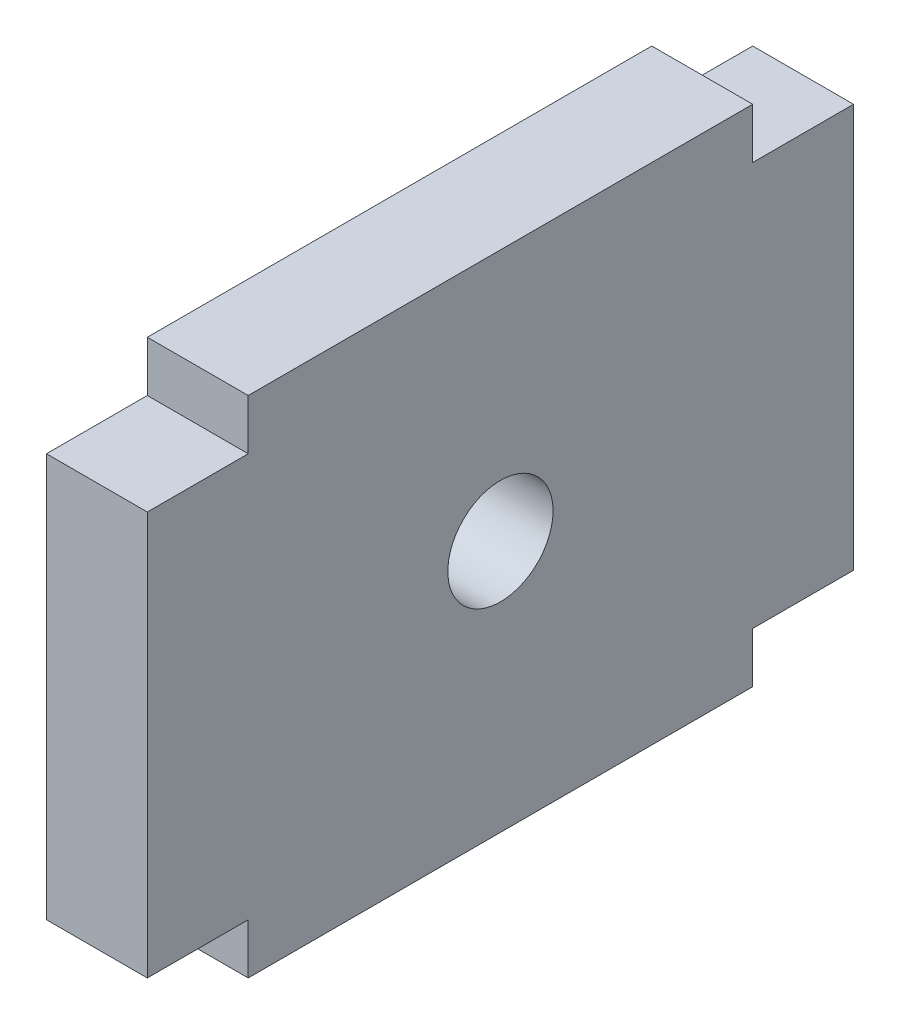
ISO-10303-21;
HEADER;
FILE_DESCRIPTION(('STEP AP214'),'2;1');
FILE_NAME('part.step','',(''),(''),'','','');
FILE_SCHEMA(('AUTOMOTIVE_DESIGN { 1 0 10303 214 1 1 1 1 }'));
ENDSEC;
DATA;
#1=APPLICATION_CONTEXT('core data for automotive mechanical design processes');
#2=APPLICATION_PROTOCOL_DEFINITION('international standard','automotive_design',2000,#1);
#3=PRODUCT_CONTEXT('',#1,'mechanical');
#4=PRODUCT('Part','Part','',(#3));
#5=PRODUCT_RELATED_PRODUCT_CATEGORY('part','',(#4));
#6=PRODUCT_DEFINITION_FORMATION('','',#4);
#7=PRODUCT_DEFINITION_CONTEXT('part definition',#1,'design');
#8=PRODUCT_DEFINITION('design','',#6,#7);
#9=PRODUCT_DEFINITION_SHAPE('','',#8);
#10=(LENGTH_UNIT() NAMED_UNIT(*) SI_UNIT(.MILLI.,.METRE.));
#11=(NAMED_UNIT(*) PLANE_ANGLE_UNIT() SI_UNIT($,.RADIAN.));
#12=(NAMED_UNIT(*) SI_UNIT($,.STERADIAN.) SOLID_ANGLE_UNIT());
#13=UNCERTAINTY_MEASURE_WITH_UNIT(LENGTH_MEASURE(1.E-05),#10,'distance_accuracy_value','');
#14=(GEOMETRIC_REPRESENTATION_CONTEXT(3) GLOBAL_UNCERTAINTY_ASSIGNED_CONTEXT((#13)) GLOBAL_UNIT_ASSIGNED_CONTEXT((#10,
#11,#12)) REPRESENTATION_CONTEXT('',''));
#15=CARTESIAN_POINT('',(0.,0.,0.));
#16=DIRECTION('',(0.,0.,1.));
#17=DIRECTION('',(1.,0.,0.));
#18=AXIS2_PLACEMENT_3D('',#15,#16,#17);
#19=CARTESIAN_POINT('',(3.,-6.,0.));
#20=DIRECTION('',(0.,1.,0.));
#21=DIRECTION('',(0.,0.,1.));
#22=AXIS2_PLACEMENT_3D('',#19,#20,#21);
#23=PLANE('',#22);
#24=DIRECTION('',(0.,0.,-1.));
#25=VECTOR('',#24,1.);
#26=CARTESIAN_POINT('',(0.,-6.,0.));
#27=LINE('',#26,#25);
#28=CARTESIAN_POINT('',(0.,-6.,-7.5));
#29=VERTEX_POINT('',#28);
#30=CARTESIAN_POINT('',(0.,-6.,-10.5));
#31=VERTEX_POINT('',#30);
#32=EDGE_CURVE('E178',#29,#31,#27,.T.);
#33=ORIENTED_EDGE('',*,*,#32,.T.);
#34=DIRECTION('',(-1.,0.,0.));
#35=VECTOR('',#34,1.);
#36=CARTESIAN_POINT('',(3.,-6.,-10.5));
#37=LINE('',#36,#35);
#38=CARTESIAN_POINT('',(3.,-6.,-10.5));
#39=VERTEX_POINT('',#38);
#40=EDGE_CURVE('E11',#39,#31,#37,.T.);
#41=ORIENTED_EDGE('',*,*,#40,.F.);
#42=DIRECTION('',(0.,0.,-1.));
#43=VECTOR('',#42,1.);
#44=CARTESIAN_POINT('',(3.,-6.,0.));
#45=LINE('',#44,#43);
#46=CARTESIAN_POINT('',(3.,-6.,-7.5));
#47=VERTEX_POINT('',#46);
#48=EDGE_CURVE('E171',#47,#39,#45,.T.);
#49=ORIENTED_EDGE('',*,*,#48,.F.);
#50=DIRECTION('',(-1.,0.,0.));
#51=VECTOR('',#50,1.);
#52=CARTESIAN_POINT('',(3.,-6.,-7.5));
#53=LINE('',#52,#51);
#54=EDGE_CURVE('E212',#47,#29,#53,.T.);
#55=ORIENTED_EDGE('',*,*,#54,.T.);
#56=EDGE_LOOP('',(#33,#41,#49,#55));
#57=FACE_BOUND('',#56,.T.);
#58=ADVANCED_FACE('F35',(#57),#23,.F.);
#59=CARTESIAN_POINT('',(3.,0.,-10.5));
#60=DIRECTION('',(0.,0.,1.));
#61=DIRECTION('',(1.,0.,0.));
#62=AXIS2_PLACEMENT_3D('',#59,#60,#61);
#63=PLANE('',#62);
#64=DIRECTION('',(0.,1.,0.));
#65=VECTOR('',#64,1.);
#66=CARTESIAN_POINT('',(0.,0.,-10.5));
#67=LINE('',#66,#65);
#68=CARTESIAN_POINT('',(0.,6.,-10.5));
#69=VERTEX_POINT('',#68);
#70=EDGE_CURVE('E182',#31,#69,#67,.T.);
#71=ORIENTED_EDGE('',*,*,#70,.T.);
#72=DIRECTION('',(-1.,0.,0.));
#73=VECTOR('',#72,1.);
#74=CARTESIAN_POINT('',(3.,6.,-10.5));
#75=LINE('',#74,#73);
#76=CARTESIAN_POINT('',(3.,6.,-10.5));
#77=VERTEX_POINT('',#76);
#78=EDGE_CURVE('E43',#77,#69,#75,.T.);
#79=ORIENTED_EDGE('',*,*,#78,.F.);
#80=DIRECTION('',(0.,1.,0.));
#81=VECTOR('',#80,1.);
#82=CARTESIAN_POINT('',(3.,0.,-10.5));
#83=LINE('',#82,#81);
#84=EDGE_CURVE('E105',#39,#77,#83,.T.);
#85=ORIENTED_EDGE('',*,*,#84,.F.);
#86=ORIENTED_EDGE('',*,*,#40,.T.);
#87=EDGE_LOOP('',(#71,#79,#85,#86));
#88=FACE_BOUND('',#87,.T.);
#89=ADVANCED_FACE('F231',(#88),#63,.F.);
#90=CARTESIAN_POINT('',(3.,6.,0.));
#91=DIRECTION('',(0.,1.,0.));
#92=DIRECTION('',(0.,0.,1.));
#93=AXIS2_PLACEMENT_3D('',#90,#91,#92);
#94=PLANE('',#93);
#95=DIRECTION('',(0.,0.,-1.));
#96=VECTOR('',#95,1.);
#97=CARTESIAN_POINT('',(0.,6.,0.));
#98=LINE('',#97,#96);
#99=CARTESIAN_POINT('',(0.,6.,-7.5));
#100=VERTEX_POINT('',#99);
#101=EDGE_CURVE('E188',#100,#69,#98,.T.);
#102=ORIENTED_EDGE('',*,*,#101,.F.);
#103=DIRECTION('',(-1.,0.,0.));
#104=VECTOR('',#103,1.);
#105=CARTESIAN_POINT('',(3.,6.,-7.5));
#106=LINE('',#105,#104);
#107=CARTESIAN_POINT('',(3.,6.,-7.5));
#108=VERTEX_POINT('',#107);
#109=EDGE_CURVE('E226',#108,#100,#106,.T.);
#110=ORIENTED_EDGE('',*,*,#109,.F.);
#111=DIRECTION('',(0.,0.,-1.));
#112=VECTOR('',#111,1.);
#113=CARTESIAN_POINT('',(3.,6.,0.));
#114=LINE('',#113,#112);
#115=EDGE_CURVE('E165',#108,#77,#114,.T.);
#116=ORIENTED_EDGE('',*,*,#115,.T.);
#117=ORIENTED_EDGE('',*,*,#78,.T.);
#118=EDGE_LOOP('',(#102,#110,#116,#117));
#119=FACE_BOUND('',#118,.T.);
#120=ADVANCED_FACE('F229',(#119),#94,.T.);
#121=CARTESIAN_POINT('',(3.,0.,-7.5));
#122=DIRECTION('',(0.,0.,1.));
#123=DIRECTION('',(0.,-1.,0.));
#124=AXIS2_PLACEMENT_3D('',#121,#122,#123);
#125=PLANE('',#124);
#126=DIRECTION('',(0.,1.,0.));
#127=VECTOR('',#126,1.);
#128=CARTESIAN_POINT('',(0.,0.,-7.5));
#129=LINE('',#128,#127);
#130=CARTESIAN_POINT('',(0.,7.5,-7.5));
#131=VERTEX_POINT('',#130);
#132=EDGE_CURVE('E193',#100,#131,#129,.T.);
#133=ORIENTED_EDGE('',*,*,#132,.T.);
#134=DIRECTION('',(-1.,0.,0.));
#135=VECTOR('',#134,1.);
#136=CARTESIAN_POINT('',(3.,7.5,-7.5));
#137=LINE('',#136,#135);
#138=CARTESIAN_POINT('',(3.,7.5,-7.5));
#139=VERTEX_POINT('',#138);
#140=EDGE_CURVE('E224',#139,#131,#137,.T.);
#141=ORIENTED_EDGE('',*,*,#140,.F.);
#142=DIRECTION('',(0.,1.,0.));
#143=VECTOR('',#142,1.);
#144=CARTESIAN_POINT('',(3.,0.,-7.5));
#145=LINE('',#144,#143);
#146=EDGE_CURVE('E162',#108,#139,#145,.T.);
#147=ORIENTED_EDGE('',*,*,#146,.F.);
#148=ORIENTED_EDGE('',*,*,#109,.T.);
#149=EDGE_LOOP('',(#133,#141,#147,#148));
#150=FACE_BOUND('',#149,.T.);
#151=ADVANCED_FACE('F238',(#150),#125,.F.);
#152=CARTESIAN_POINT('',(3.,7.5,0.));
#153=DIRECTION('',(0.,1.,0.));
#154=DIRECTION('',(0.,0.,1.));
#155=AXIS2_PLACEMENT_3D('',#152,#153,#154);
#156=PLANE('',#155);
#157=DIRECTION('',(0.,0.,-1.));
#158=VECTOR('',#157,1.);
#159=CARTESIAN_POINT('',(0.,7.5,0.));
#160=LINE('',#159,#158);
#161=CARTESIAN_POINT('',(0.,7.5,7.5));
#162=VERTEX_POINT('',#161);
#163=EDGE_CURVE('E196',#162,#131,#160,.T.);
#164=ORIENTED_EDGE('',*,*,#163,.F.);
#165=DIRECTION('',(-1.,0.,0.));
#166=VECTOR('',#165,1.);
#167=CARTESIAN_POINT('',(3.,7.5,7.5));
#168=LINE('',#167,#166);
#169=CARTESIAN_POINT('',(3.,7.5,7.5));
#170=VERTEX_POINT('',#169);
#171=EDGE_CURVE('E222',#170,#162,#168,.T.);
#172=ORIENTED_EDGE('',*,*,#171,.F.);
#173=DIRECTION('',(0.,0.,-1.));
#174=VECTOR('',#173,1.);
#175=CARTESIAN_POINT('',(3.,7.5,0.));
#176=LINE('',#175,#174);
#177=EDGE_CURVE('E158',#170,#139,#176,.T.);
#178=ORIENTED_EDGE('',*,*,#177,.T.);
#179=ORIENTED_EDGE('',*,*,#140,.T.);
#180=EDGE_LOOP('',(#164,#172,#178,#179));
#181=FACE_BOUND('',#180,.T.);
#182=ADVANCED_FACE('F250',(#181),#156,.T.);
#183=CARTESIAN_POINT('',(3.,0.,7.5));
#184=DIRECTION('',(0.,0.,1.));
#185=DIRECTION('',(1.,0.,0.));
#186=AXIS2_PLACEMENT_3D('',#183,#184,#185);
#187=PLANE('',#186);
#188=DIRECTION('',(0.,1.,0.));
#189=VECTOR('',#188,1.);
#190=CARTESIAN_POINT('',(0.,0.,7.5));
#191=LINE('',#190,#189);
#192=CARTESIAN_POINT('',(0.,6.,7.5));
#193=VERTEX_POINT('',#192);
#194=EDGE_CURVE('E199',#193,#162,#191,.T.);
#195=ORIENTED_EDGE('',*,*,#194,.F.);
#196=DIRECTION('',(-1.,0.,0.));
#197=VECTOR('',#196,1.);
#198=CARTESIAN_POINT('',(3.,6.,7.5));
#199=LINE('',#198,#197);
#200=CARTESIAN_POINT('',(3.,6.,7.5));
#201=VERTEX_POINT('',#200);
#202=EDGE_CURVE('E220',#201,#193,#199,.T.);
#203=ORIENTED_EDGE('',*,*,#202,.F.);
#204=DIRECTION('',(0.,1.,0.));
#205=VECTOR('',#204,1.);
#206=CARTESIAN_POINT('',(3.,0.,7.5));
#207=LINE('',#206,#205);
#208=EDGE_CURVE('E151',#201,#170,#207,.T.);
#209=ORIENTED_EDGE('',*,*,#208,.T.);
#210=ORIENTED_EDGE('',*,*,#171,.T.);
#211=EDGE_LOOP('',(#195,#203,#209,#210));
#212=FACE_BOUND('',#211,.T.);
#213=ADVANCED_FACE('F253',(#212),#187,.T.);
#214=CARTESIAN_POINT('',(3.,6.,0.));
#215=DIRECTION('',(0.,-1.,0.));
#216=DIRECTION('',(0.,0.,-1.));
#217=AXIS2_PLACEMENT_3D('',#214,#215,#216);
#218=PLANE('',#217);
#219=DIRECTION('',(0.,0.,1.));
#220=VECTOR('',#219,1.);
#221=CARTESIAN_POINT('',(0.,6.,0.));
#222=LINE('',#221,#220);
#223=CARTESIAN_POINT('',(0.,6.,10.5));
#224=VERTEX_POINT('',#223);
#225=EDGE_CURVE('E202',#193,#224,#222,.T.);
#226=ORIENTED_EDGE('',*,*,#225,.T.);
#227=DIRECTION('',(-1.,0.,0.));
#228=VECTOR('',#227,1.);
#229=CARTESIAN_POINT('',(3.,6.,10.5));
#230=LINE('',#229,#228);
#231=CARTESIAN_POINT('',(3.,6.,10.5));
#232=VERTEX_POINT('',#231);
#233=EDGE_CURVE('E218',#232,#224,#230,.T.);
#234=ORIENTED_EDGE('',*,*,#233,.F.);
#235=DIRECTION('',(0.,0.,1.));
#236=VECTOR('',#235,1.);
#237=CARTESIAN_POINT('',(3.,6.,0.));
#238=LINE('',#237,#236);
#239=EDGE_CURVE('E157',#201,#232,#238,.T.);
#240=ORIENTED_EDGE('',*,*,#239,.F.);
#241=ORIENTED_EDGE('',*,*,#202,.T.);
#242=EDGE_LOOP('',(#226,#234,#240,#241));
#243=FACE_BOUND('',#242,.T.);
#244=ADVANCED_FACE('F254',(#243),#218,.F.);
#245=CARTESIAN_POINT('',(3.,0.,10.5));
#246=DIRECTION('',(0.,0.,1.));
#247=DIRECTION('',(0.,-1.,0.));
#248=AXIS2_PLACEMENT_3D('',#245,#246,#247);
#249=PLANE('',#248);
#250=DIRECTION('',(0.,1.,0.));
#251=VECTOR('',#250,1.);
#252=CARTESIAN_POINT('',(0.,0.,10.5));
#253=LINE('',#252,#251);
#254=CARTESIAN_POINT('',(0.,-6.,10.5));
#255=VERTEX_POINT('',#254);
#256=EDGE_CURVE('E205',#255,#224,#253,.T.);
#257=ORIENTED_EDGE('',*,*,#256,.F.);
#258=DIRECTION('',(-1.,0.,0.));
#259=VECTOR('',#258,1.);
#260=CARTESIAN_POINT('',(3.,-6.,10.5));
#261=LINE('',#260,#259);
#262=CARTESIAN_POINT('',(3.,-6.,10.5));
#263=VERTEX_POINT('',#262);
#264=EDGE_CURVE('E216',#263,#255,#261,.T.);
#265=ORIENTED_EDGE('',*,*,#264,.F.);
#266=DIRECTION('',(0.,1.,0.));
#267=VECTOR('',#266,1.);
#268=CARTESIAN_POINT('',(3.,0.,10.5));
#269=LINE('',#268,#267);
#270=EDGE_CURVE('E152',#263,#232,#269,.T.);
#271=ORIENTED_EDGE('',*,*,#270,.T.);
#272=ORIENTED_EDGE('',*,*,#233,.T.);
#273=EDGE_LOOP('',(#257,#265,#271,#272));
#274=FACE_BOUND('',#273,.T.);
#275=ADVANCED_FACE('F257',(#274),#249,.T.);
#276=CARTESIAN_POINT('',(3.,-6.,0.));
#277=DIRECTION('',(0.,-1.,0.));
#278=DIRECTION('',(0.,0.,-1.));
#279=AXIS2_PLACEMENT_3D('',#276,#277,#278);
#280=PLANE('',#279);
#281=DIRECTION('',(0.,0.,1.));
#282=VECTOR('',#281,1.);
#283=CARTESIAN_POINT('',(0.,-6.,0.));
#284=LINE('',#283,#282);
#285=CARTESIAN_POINT('',(0.,-6.,7.5));
#286=VERTEX_POINT('',#285);
#287=EDGE_CURVE('E208',#286,#255,#284,.T.);
#288=ORIENTED_EDGE('',*,*,#287,.F.);
#289=DIRECTION('',(-1.,0.,0.));
#290=VECTOR('',#289,1.);
#291=CARTESIAN_POINT('',(3.,-6.,7.5));
#292=LINE('',#291,#290);
#293=CARTESIAN_POINT('',(3.,-6.,7.5));
#294=VERTEX_POINT('',#293);
#295=EDGE_CURVE('E139',#294,#286,#292,.T.);
#296=ORIENTED_EDGE('',*,*,#295,.F.);
#297=DIRECTION('',(0.,0.,1.));
#298=VECTOR('',#297,1.);
#299=CARTESIAN_POINT('',(3.,-6.,0.));
#300=LINE('',#299,#298);
#301=EDGE_CURVE('E149',#294,#263,#300,.T.);
#302=ORIENTED_EDGE('',*,*,#301,.T.);
#303=ORIENTED_EDGE('',*,*,#264,.T.);
#304=EDGE_LOOP('',(#288,#296,#302,#303));
#305=FACE_BOUND('',#304,.T.);
#306=ADVANCED_FACE('F261',(#305),#280,.T.);
#307=CARTESIAN_POINT('',(0.,-7.5,7.5));
#308=VERTEX_POINT('',#307);
#309=EDGE_CURVE('E138',#308,#286,#191,.T.);
#310=ORIENTED_EDGE('',*,*,#309,.F.);
#311=DIRECTION('',(-1.,0.,0.));
#312=VECTOR('',#311,1.);
#313=CARTESIAN_POINT('',(3.,-7.5,7.5));
#314=LINE('',#313,#312);
#315=CARTESIAN_POINT('',(3.,-7.5,7.5));
#316=VERTEX_POINT('',#315);
#317=EDGE_CURVE('E132',#316,#308,#314,.T.);
#318=ORIENTED_EDGE('',*,*,#317,.F.);
#319=EDGE_CURVE('E136',#316,#294,#207,.T.);
#320=ORIENTED_EDGE('',*,*,#319,.T.);
#321=ORIENTED_EDGE('',*,*,#295,.T.);
#322=EDGE_LOOP('',(#310,#318,#320,#321));
#323=FACE_BOUND('',#322,.T.);
#324=ADVANCED_FACE('F134',(#323),#187,.T.);
#325=CARTESIAN_POINT('',(3.,-7.5,0.));
#326=DIRECTION('',(0.,1.,0.));
#327=DIRECTION('',(0.,0.,1.));
#328=AXIS2_PLACEMENT_3D('',#325,#326,#327);
#329=PLANE('',#328);
#330=DIRECTION('',(0.,0.,-1.));
#331=VECTOR('',#330,1.);
#332=CARTESIAN_POINT('',(0.,-7.5,0.));
#333=LINE('',#332,#331);
#334=CARTESIAN_POINT('',(0.,-7.5,-7.5));
#335=VERTEX_POINT('',#334);
#336=EDGE_CURVE('E91',#308,#335,#333,.T.);
#337=ORIENTED_EDGE('',*,*,#336,.T.);
#338=DIRECTION('',(-1.,0.,0.));
#339=VECTOR('',#338,1.);
#340=CARTESIAN_POINT('',(3.,-7.5,-7.5));
#341=LINE('',#340,#339);
#342=CARTESIAN_POINT('',(3.,-7.5,-7.5));
#343=VERTEX_POINT('',#342);
#344=EDGE_CURVE('E140',#343,#335,#341,.T.);
#345=ORIENTED_EDGE('',*,*,#344,.F.);
#346=DIRECTION('',(0.,0.,-1.));
#347=VECTOR('',#346,1.);
#348=CARTESIAN_POINT('',(3.,-7.5,0.));
#349=LINE('',#348,#347);
#350=EDGE_CURVE('E142',#316,#343,#349,.T.);
#351=ORIENTED_EDGE('',*,*,#350,.F.);
#352=ORIENTED_EDGE('',*,*,#317,.T.);
#353=EDGE_LOOP('',(#337,#345,#351,#352));
#354=FACE_BOUND('',#353,.T.);
#355=ADVANCED_FACE('F143',(#354),#329,.F.);
#356=EDGE_CURVE('E97',#335,#29,#129,.T.);
#357=ORIENTED_EDGE('',*,*,#356,.T.);
#358=ORIENTED_EDGE('',*,*,#54,.F.);
#359=EDGE_CURVE('E51',#343,#47,#145,.T.);
#360=ORIENTED_EDGE('',*,*,#359,.F.);
#361=ORIENTED_EDGE('',*,*,#344,.T.);
#362=EDGE_LOOP('',(#357,#358,#360,#361));
#363=FACE_BOUND('',#362,.T.);
#364=ADVANCED_FACE('F270',(#363),#125,.F.);
#365=CARTESIAN_POINT('',(3.,0.,0.));
#366=DIRECTION('',(1.,0.,0.));
#367=DIRECTION('',(0.,0.,-1.));
#368=AXIS2_PLACEMENT_3D('',#365,#366,#367);
#369=PLANE('',#368);
#370=CARTESIAN_POINT('',(3.,0.,0.));
#371=DIRECTION('',(1.,0.,0.));
#372=DIRECTION('',(0.,0.,-1.));
#373=AXIS2_PLACEMENT_3D('',#370,#371,#372);
#374=CIRCLE('',#373,1.565);
#375=CARTESIAN_POINT('',(3.,0.,-1.565));
#376=VERTEX_POINT('',#375);
#377=EDGE_CURVE('E173',#376,#376,#374,.T.);
#378=ORIENTED_EDGE('',*,*,#377,.F.);
#379=EDGE_LOOP('',(#378));
#380=FACE_BOUND('',#379,.T.);
#381=ORIENTED_EDGE('',*,*,#48,.T.);
#382=ORIENTED_EDGE('',*,*,#84,.T.);
#383=ORIENTED_EDGE('',*,*,#115,.F.);
#384=ORIENTED_EDGE('',*,*,#146,.T.);
#385=ORIENTED_EDGE('',*,*,#177,.F.);
#386=ORIENTED_EDGE('',*,*,#208,.F.);
#387=ORIENTED_EDGE('',*,*,#239,.T.);
#388=ORIENTED_EDGE('',*,*,#270,.F.);
#389=ORIENTED_EDGE('',*,*,#301,.F.);
#390=ORIENTED_EDGE('',*,*,#319,.F.);
#391=ORIENTED_EDGE('',*,*,#350,.T.);
#392=ORIENTED_EDGE('',*,*,#359,.T.);
#393=EDGE_LOOP('',(#381,#382,#383,#384,#385,#386,#387,#388,#389,#390,#391,#392));
#394=FACE_BOUND('',#393,.T.);
#395=ADVANCED_FACE('F146',(#380,#394),#369,.T.);
#396=CARTESIAN_POINT('',(0.,0.,0.));
#397=DIRECTION('',(1.,0.,0.));
#398=DIRECTION('',(0.,0.,-1.));
#399=AXIS2_PLACEMENT_3D('',#396,#397,#398);
#400=PLANE('',#399);
#401=CARTESIAN_POINT('',(0.,0.,0.));
#402=DIRECTION('',(1.,0.,0.));
#403=DIRECTION('',(0.,0.,-1.));
#404=AXIS2_PLACEMENT_3D('',#401,#402,#403);
#405=CIRCLE('',#404,1.565);
#406=CARTESIAN_POINT('',(0.,0.,-1.565));
#407=VERTEX_POINT('',#406);
#408=EDGE_CURVE('E176',#407,#407,#405,.T.);
#409=ORIENTED_EDGE('',*,*,#408,.T.);
#410=EDGE_LOOP('',(#409));
#411=FACE_BOUND('',#410,.T.);
#412=ORIENTED_EDGE('',*,*,#32,.F.);
#413=ORIENTED_EDGE('',*,*,#356,.F.);
#414=ORIENTED_EDGE('',*,*,#336,.F.);
#415=ORIENTED_EDGE('',*,*,#309,.T.);
#416=ORIENTED_EDGE('',*,*,#287,.T.);
#417=ORIENTED_EDGE('',*,*,#256,.T.);
#418=ORIENTED_EDGE('',*,*,#225,.F.);
#419=ORIENTED_EDGE('',*,*,#194,.T.);
#420=ORIENTED_EDGE('',*,*,#163,.T.);
#421=ORIENTED_EDGE('',*,*,#132,.F.);
#422=ORIENTED_EDGE('',*,*,#101,.T.);
#423=ORIENTED_EDGE('',*,*,#70,.F.);
#424=EDGE_LOOP('',(#412,#413,#414,#415,#416,#417,#418,#419,#420,#421,#422,#423));
#425=FACE_BOUND('',#424,.T.);
#426=ADVANCED_FACE('F234',(#411,#425),#400,.F.);
#427=CARTESIAN_POINT('',(0.,0.,0.));
#428=DIRECTION('',(1.,0.,0.));
#429=DIRECTION('',(0.,0.,-1.));
#430=AXIS2_PLACEMENT_3D('',#427,#428,#429);
#431=CYLINDRICAL_SURFACE('',#430,1.565);
#432=ORIENTED_EDGE('',*,*,#408,.F.);
#433=EDGE_LOOP('',(#432));
#434=FACE_BOUND('',#433,.T.);
#435=ORIENTED_EDGE('',*,*,#377,.T.);
#436=EDGE_LOOP('',(#435));
#437=FACE_BOUND('',#436,.T.);
#438=ADVANCED_FACE('F275',(#434,#437),#431,.F.);
#439=CLOSED_SHELL('',(#58,#89,#120,#151,#182,#213,#244,#275,#306,#324,#355,#364,#395,#426,#438));
#440=MANIFOLD_SOLID_BREP('B2',#439);
#441=ADVANCED_BREP_SHAPE_REPRESENTATION('',(#18,#440),#14);
#442=SHAPE_DEFINITION_REPRESENTATION(#9,#441);
ENDSEC;
END-ISO-10303-21;
